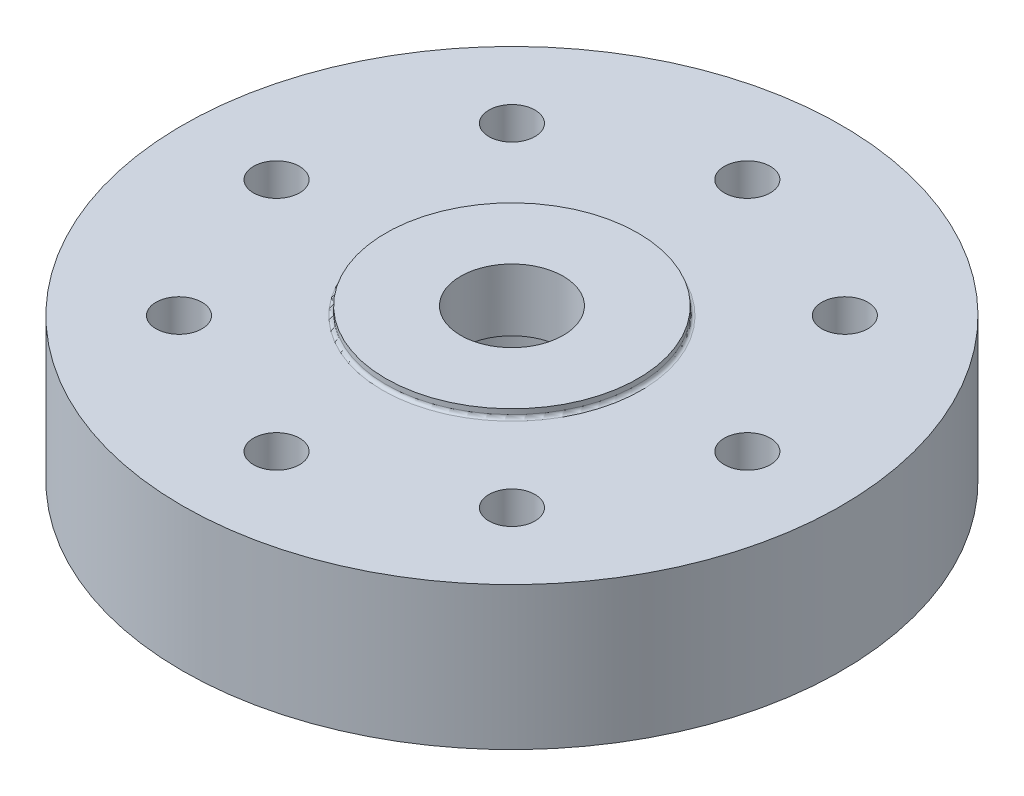
ISO-10303-21;
HEADER;
FILE_DESCRIPTION(('STEP AP214'),'2;1');
FILE_NAME('part.step','',(''),(''),'','','');
FILE_SCHEMA(('AUTOMOTIVE_DESIGN { 1 0 10303 214 1 1 1 1 }'));
ENDSEC;
DATA;
#1=APPLICATION_CONTEXT('core data for automotive mechanical design processes');
#2=APPLICATION_PROTOCOL_DEFINITION('international standard','automotive_design',2000,#1);
#3=PRODUCT_CONTEXT('',#1,'mechanical');
#4=PRODUCT('Part','Part','',(#3));
#5=PRODUCT_RELATED_PRODUCT_CATEGORY('part','',(#4));
#6=PRODUCT_DEFINITION_FORMATION('','',#4);
#7=PRODUCT_DEFINITION_CONTEXT('part definition',#1,'design');
#8=PRODUCT_DEFINITION('design','',#6,#7);
#9=PRODUCT_DEFINITION_SHAPE('','',#8);
#10=(LENGTH_UNIT() NAMED_UNIT(*) SI_UNIT(.MILLI.,.METRE.));
#11=(NAMED_UNIT(*) PLANE_ANGLE_UNIT() SI_UNIT($,.RADIAN.));
#12=(NAMED_UNIT(*) SI_UNIT($,.STERADIAN.) SOLID_ANGLE_UNIT());
#13=UNCERTAINTY_MEASURE_WITH_UNIT(LENGTH_MEASURE(1.E-05),#10,'distance_accuracy_value','');
#14=(GEOMETRIC_REPRESENTATION_CONTEXT(3) GLOBAL_UNCERTAINTY_ASSIGNED_CONTEXT((#13)) GLOBAL_UNIT_ASSIGNED_CONTEXT((#10,
#11,#12)) REPRESENTATION_CONTEXT('',''));
#15=CARTESIAN_POINT('',(0.,0.,0.));
#16=DIRECTION('',(0.,0.,1.));
#17=DIRECTION('',(1.,0.,0.));
#18=AXIS2_PLACEMENT_3D('',#15,#16,#17);
#19=CARTESIAN_POINT('',(0.,4.25,0.));
#20=DIRECTION('',(0.,1.,0.));
#21=DIRECTION('',(0.,0.,1.));
#22=AXIS2_PLACEMENT_3D('',#19,#20,#21);
#23=PLANE('',#22);
#24=CARTESIAN_POINT('',(0.,4.25,0.));
#25=DIRECTION('',(0.,1.,0.));
#26=DIRECTION('',(0.,0.,1.));
#27=AXIS2_PLACEMENT_3D('',#24,#25,#26);
#28=CIRCLE('',#27,3.85);
#29=CARTESIAN_POINT('',(0.,4.25,3.85));
#30=VERTEX_POINT('',#29);
#31=EDGE_CURVE('E11',#30,#30,#28,.F.);
#32=ORIENTED_EDGE('',*,*,#31,.T.);
#33=EDGE_LOOP('',(#32));
#34=FACE_BOUND('',#33,.T.);
#35=CARTESIAN_POINT('',(-4.94974746830577,4.25,-4.94974746830589));
#36=DIRECTION('',(0.,1.,0.));
#37=DIRECTION('',(0.,0.,1.));
#38=AXIS2_PLACEMENT_3D('',#35,#36,#37);
#39=CIRCLE('',#38,0.684999999999999);
#40=CARTESIAN_POINT('',(-4.94974746830577,4.25,-4.26474746830589));
#41=VERTEX_POINT('',#40);
#42=EDGE_CURVE('E326',#41,#41,#39,.T.);
#43=ORIENTED_EDGE('',*,*,#42,.F.);
#44=EDGE_LOOP('',(#43));
#45=FACE_BOUND('',#44,.T.);
#46=CARTESIAN_POINT('',(-4.94974746830588,4.25,4.94974746830579));
#47=DIRECTION('',(0.,1.,0.));
#48=DIRECTION('',(0.,0.,1.));
#49=AXIS2_PLACEMENT_3D('',#46,#47,#48);
#50=CIRCLE('',#49,0.685000000000001);
#51=CARTESIAN_POINT('',(-4.94974746830588,4.25,5.63474746830579));
#52=VERTEX_POINT('',#51);
#53=EDGE_CURVE('E341',#52,#52,#50,.T.);
#54=ORIENTED_EDGE('',*,*,#53,.F.);
#55=EDGE_LOOP('',(#54));
#56=FACE_BOUND('',#55,.T.);
#57=CARTESIAN_POINT('',(4.94974746830581,4.25,4.94974746830586));
#58=DIRECTION('',(0.,1.,0.));
#59=DIRECTION('',(0.,0.,1.));
#60=AXIS2_PLACEMENT_3D('',#57,#58,#59);
#61=CIRCLE('',#60,0.685);
#62=CARTESIAN_POINT('',(4.94974746830581,4.25,5.63474746830586));
#63=VERTEX_POINT('',#62);
#64=EDGE_CURVE('E356',#63,#63,#61,.T.);
#65=ORIENTED_EDGE('',*,*,#64,.F.);
#66=EDGE_LOOP('',(#65));
#67=FACE_BOUND('',#66,.T.);
#68=CARTESIAN_POINT('',(4.94974746830584,4.25,-4.94974746830583));
#69=DIRECTION('',(0.,1.,0.));
#70=DIRECTION('',(0.,0.,1.));
#71=AXIS2_PLACEMENT_3D('',#68,#69,#70);
#72=CIRCLE('',#71,0.685);
#73=CARTESIAN_POINT('',(4.94974746830584,4.25,-4.26474746830583));
#74=VERTEX_POINT('',#73);
#75=EDGE_CURVE('E372',#74,#74,#72,.T.);
#76=ORIENTED_EDGE('',*,*,#75,.F.);
#77=EDGE_LOOP('',(#76));
#78=FACE_BOUND('',#77,.T.);
#79=CARTESIAN_POINT('',(0.,4.25,-7.));
#80=DIRECTION('',(0.,1.,0.));
#81=DIRECTION('',(0.,0.,1.));
#82=AXIS2_PLACEMENT_3D('',#79,#80,#81);
#83=CIRCLE('',#82,0.685);
#84=CARTESIAN_POINT('',(0.,4.25,-6.315));
#85=VERTEX_POINT('',#84);
#86=EDGE_CURVE('E380',#85,#85,#83,.T.);
#87=ORIENTED_EDGE('',*,*,#86,.F.);
#88=EDGE_LOOP('',(#87));
#89=FACE_BOUND('',#88,.T.);
#90=CARTESIAN_POINT('',(0.,4.25,0.));
#91=DIRECTION('',(0.,1.,0.));
#92=DIRECTION('',(0.,0.,1.));
#93=AXIS2_PLACEMENT_3D('',#90,#91,#92);
#94=CIRCLE('',#93,9.8);
#95=CARTESIAN_POINT('',(0.,4.25,9.8));
#96=VERTEX_POINT('',#95);
#97=EDGE_CURVE('E388',#96,#96,#94,.T.);
#98=ORIENTED_EDGE('',*,*,#97,.T.);
#99=EDGE_LOOP('',(#98));
#100=FACE_BOUND('',#99,.T.);
#101=CARTESIAN_POINT('',(7.,4.25,0.));
#102=DIRECTION('',(0.,1.,0.));
#103=DIRECTION('',(0.,0.,1.));
#104=AXIS2_PLACEMENT_3D('',#101,#102,#103);
#105=CIRCLE('',#104,0.685);
#106=CARTESIAN_POINT('',(7.,4.25,0.685000000000024));
#107=VERTEX_POINT('',#106);
#108=EDGE_CURVE('E364',#107,#107,#105,.T.);
#109=ORIENTED_EDGE('',*,*,#108,.F.);
#110=EDGE_LOOP('',(#109));
#111=FACE_BOUND('',#110,.T.);
#112=CARTESIAN_POINT('',(0.,4.25,7.));
#113=DIRECTION('',(0.,1.,0.));
#114=DIRECTION('',(0.,0.,1.));
#115=AXIS2_PLACEMENT_3D('',#112,#113,#114);
#116=CIRCLE('',#115,0.685);
#117=CARTESIAN_POINT('',(0.,4.25,7.685));
#118=VERTEX_POINT('',#117);
#119=EDGE_CURVE('E349',#118,#118,#116,.T.);
#120=ORIENTED_EDGE('',*,*,#119,.F.);
#121=EDGE_LOOP('',(#120));
#122=FACE_BOUND('',#121,.T.);
#123=CARTESIAN_POINT('',(-7.,4.25,0.));
#124=DIRECTION('',(0.,1.,0.));
#125=DIRECTION('',(0.,0.,1.));
#126=AXIS2_PLACEMENT_3D('',#123,#124,#125);
#127=CIRCLE('',#126,0.685);
#128=CARTESIAN_POINT('',(-7.,4.25,0.684999999999927));
#129=VERTEX_POINT('',#128);
#130=EDGE_CURVE('E333',#129,#129,#127,.T.);
#131=ORIENTED_EDGE('',*,*,#130,.F.);
#132=EDGE_LOOP('',(#131));
#133=FACE_BOUND('',#132,.T.);
#134=ADVANCED_FACE('F55',(#34,#45,#56,#67,#78,#89,#100,#111,#122,#133),#23,.T.);
#135=CARTESIAN_POINT('',(0.,4.25,0.));
#136=DIRECTION('',(0.,-1.,0.));
#137=DIRECTION('',(0.,0.,-1.));
#138=AXIS2_PLACEMENT_3D('',#135,#136,#137);
#139=CYLINDRICAL_SURFACE('',#138,1.525);
#140=CARTESIAN_POINT('',(0.,2.65,0.));
#141=DIRECTION('',(0.,-1.,0.));
#142=DIRECTION('',(0.,0.,-1.));
#143=AXIS2_PLACEMENT_3D('',#140,#141,#142);
#144=CIRCLE('',#143,1.525);
#145=CARTESIAN_POINT('',(0.,2.65,-1.525));
#146=VERTEX_POINT('',#145);
#147=EDGE_CURVE('E395',#146,#146,#144,.T.);
#148=ORIENTED_EDGE('',*,*,#147,.T.);
#149=EDGE_LOOP('',(#148));
#150=FACE_BOUND('',#149,.T.);
#151=CARTESIAN_POINT('',(0.,4.5,0.));
#152=DIRECTION('',(0.,1.,0.));
#153=DIRECTION('',(0.,0.,1.));
#154=AXIS2_PLACEMENT_3D('',#151,#152,#153);
#155=CIRCLE('',#154,1.525);
#156=CARTESIAN_POINT('',(0.,4.5,1.525));
#157=VERTEX_POINT('',#156);
#158=EDGE_CURVE('E837',#157,#157,#155,.T.);
#159=ORIENTED_EDGE('',*,*,#158,.T.);
#160=EDGE_LOOP('',(#159));
#161=FACE_BOUND('',#160,.T.);
#162=ADVANCED_FACE('F414',(#150,#161),#139,.F.);
#163=CARTESIAN_POINT('',(0.,0.,0.));
#164=DIRECTION('',(0.,1.,0.));
#165=DIRECTION('',(0.,0.,1.));
#166=AXIS2_PLACEMENT_3D('',#163,#164,#165);
#167=PLANE('',#166);
#168=CARTESIAN_POINT('',(4.94974746830584,0.,-4.94974746830583));
#169=DIRECTION('',(0.,1.,0.));
#170=DIRECTION('',(0.,0.,1.));
#171=AXIS2_PLACEMENT_3D('',#168,#169,#170);
#172=CIRCLE('',#171,1.885);
#173=CARTESIAN_POINT('',(5.25146114998571,0.,-6.81044461031663));
#174=VERTEX_POINT('',#173);
#175=CARTESIAN_POINT('',(6.81044461031665,0.,-5.25146114998569));
#176=VERTEX_POINT('',#175);
#177=EDGE_CURVE('E268',#174,#176,#172,.T.);
#178=ORIENTED_EDGE('',*,*,#177,.F.);
#179=CARTESIAN_POINT('',(0.,0.,0.));
#180=DIRECTION('',(0.,1.,0.));
#181=DIRECTION('',(0.,0.,1.));
#182=AXIS2_PLACEMENT_3D('',#179,#180,#181);
#183=CIRCLE('',#182,8.6);
#184=CARTESIAN_POINT('',(1.10236777655768,0.,-8.52905535714286));
#185=VERTEX_POINT('',#184);
#186=EDGE_CURVE('E215',#174,#185,#183,.T.);
#187=ORIENTED_EDGE('',*,*,#186,.T.);
#188=CARTESIAN_POINT('',(0.,0.,-7.));
#189=DIRECTION('',(0.,1.,0.));
#190=DIRECTION('',(0.,0.,1.));
#191=AXIS2_PLACEMENT_3D('',#188,#189,#190);
#192=CIRCLE('',#191,1.885);
#193=CARTESIAN_POINT('',(-1.10236777655768,0.,-8.52905535714286));
#194=VERTEX_POINT('',#193);
#195=EDGE_CURVE('E263',#194,#185,#192,.T.);
#196=ORIENTED_EDGE('',*,*,#195,.F.);
#197=CARTESIAN_POINT('',(-5.25146114998562,0.,-6.8104446103167));
#198=VERTEX_POINT('',#197);
#199=EDGE_CURVE('E71',#194,#198,#183,.T.);
#200=ORIENTED_EDGE('',*,*,#199,.T.);
#201=CARTESIAN_POINT('',(-4.94974746830577,0.,-4.94974746830589));
#202=DIRECTION('',(0.,1.,0.));
#203=DIRECTION('',(0.,0.,1.));
#204=AXIS2_PLACEMENT_3D('',#201,#202,#203);
#205=CIRCLE('',#204,1.885);
#206=CARTESIAN_POINT('',(-6.81044461031657,0.,-5.25146114998578));
#207=VERTEX_POINT('',#206);
#208=EDGE_CURVE('E248',#207,#198,#205,.T.);
#209=ORIENTED_EDGE('',*,*,#208,.F.);
#210=CARTESIAN_POINT('',(-8.52905535714285,0.,-1.10236777655777));
#211=VERTEX_POINT('',#210);
#212=EDGE_CURVE('E876',#207,#211,#183,.T.);
#213=ORIENTED_EDGE('',*,*,#212,.T.);
#214=CARTESIAN_POINT('',(-7.,0.,0.));
#215=DIRECTION('',(0.,1.,0.));
#216=DIRECTION('',(0.,0.,1.));
#217=AXIS2_PLACEMENT_3D('',#214,#215,#216);
#218=CIRCLE('',#217,1.885);
#219=CARTESIAN_POINT('',(-8.52905535714287,0.,1.10236777655759));
#220=VERTEX_POINT('',#219);
#221=EDGE_CURVE('E190',#220,#211,#218,.T.);
#222=ORIENTED_EDGE('',*,*,#221,.F.);
#223=CARTESIAN_POINT('',(-6.81044461031669,0.,5.25146114998564));
#224=VERTEX_POINT('',#223);
#225=EDGE_CURVE('E174',#220,#224,#183,.T.);
#226=ORIENTED_EDGE('',*,*,#225,.T.);
#227=CARTESIAN_POINT('',(-4.94974746830588,0.,4.94974746830579));
#228=DIRECTION('',(0.,1.,0.));
#229=DIRECTION('',(0.,0.,1.));
#230=AXIS2_PLACEMENT_3D('',#227,#228,#229);
#231=CIRCLE('',#230,1.885);
#232=CARTESIAN_POINT('',(-5.25146114998576,0.,6.81044461031659));
#233=VERTEX_POINT('',#232);
#234=EDGE_CURVE('E189',#233,#224,#231,.T.);
#235=ORIENTED_EDGE('',*,*,#234,.F.);
#236=CARTESIAN_POINT('',(-1.10236777655774,0.,8.52905535714285));
#237=VERTEX_POINT('',#236);
#238=EDGE_CURVE('E884',#233,#237,#183,.T.);
#239=ORIENTED_EDGE('',*,*,#238,.T.);
#240=CARTESIAN_POINT('',(0.,0.,7.));
#241=DIRECTION('',(0.,1.,0.));
#242=DIRECTION('',(0.,0.,1.));
#243=AXIS2_PLACEMENT_3D('',#240,#241,#242);
#244=CIRCLE('',#243,1.885);
#245=CARTESIAN_POINT('',(1.10236777655762,0.,8.52905535714287));
#246=VERTEX_POINT('',#245);
#247=EDGE_CURVE('E282',#246,#237,#244,.T.);
#248=ORIENTED_EDGE('',*,*,#247,.F.);
#249=CARTESIAN_POINT('',(5.25146114998567,0.,6.81044461031666));
#250=VERTEX_POINT('',#249);
#251=EDGE_CURVE('E887',#246,#250,#183,.T.);
#252=ORIENTED_EDGE('',*,*,#251,.T.);
#253=CARTESIAN_POINT('',(4.94974746830581,0.,4.94974746830586));
#254=DIRECTION('',(0.,1.,0.));
#255=DIRECTION('',(0.,0.,1.));
#256=AXIS2_PLACEMENT_3D('',#253,#254,#255);
#257=CIRCLE('',#256,1.885);
#258=CARTESIAN_POINT('',(6.81044461031661,0.,5.25146114998574));
#259=VERTEX_POINT('',#258);
#260=EDGE_CURVE('E277',#259,#250,#257,.T.);
#261=ORIENTED_EDGE('',*,*,#260,.F.);
#262=CARTESIAN_POINT('',(8.52905535714286,0.,1.10236777655771));
#263=VERTEX_POINT('',#262);
#264=EDGE_CURVE('E870',#259,#263,#183,.T.);
#265=ORIENTED_EDGE('',*,*,#264,.T.);
#266=CARTESIAN_POINT('',(7.,0.,0.));
#267=DIRECTION('',(0.,1.,0.));
#268=DIRECTION('',(0.,0.,1.));
#269=AXIS2_PLACEMENT_3D('',#266,#267,#268);
#270=CIRCLE('',#269,1.885);
#271=CARTESIAN_POINT('',(8.52905535714286,0.,-1.10236777655765));
#272=VERTEX_POINT('',#271);
#273=EDGE_CURVE('E273',#272,#263,#270,.T.);
#274=ORIENTED_EDGE('',*,*,#273,.F.);
#275=EDGE_CURVE('E262',#272,#176,#183,.T.);
#276=ORIENTED_EDGE('',*,*,#275,.T.);
#277=EDGE_LOOP('',(#178,#187,#196,#200,#209,#213,#222,#226,#235,#239,#248,#252,#261,#265,#274,#276));
#278=FACE_BOUND('',#277,.T.);
#279=CARTESIAN_POINT('',(0.,0.,0.));
#280=DIRECTION('',(0.,1.,0.));
#281=DIRECTION('',(0.,0.,1.));
#282=AXIS2_PLACEMENT_3D('',#279,#280,#281);
#283=CIRCLE('',#282,9.8);
#284=CARTESIAN_POINT('',(0.,0.,9.8));
#285=VERTEX_POINT('',#284);
#286=EDGE_CURVE('E384',#285,#285,#283,.T.);
#287=ORIENTED_EDGE('',*,*,#286,.F.);
#288=EDGE_LOOP('',(#287));
#289=FACE_BOUND('',#288,.T.);
#290=CARTESIAN_POINT('',(0.,0.,-7.));
#291=DIRECTION('',(0.,1.,0.));
#292=DIRECTION('',(0.,0.,1.));
#293=AXIS2_PLACEMENT_3D('',#290,#291,#292);
#294=CIRCLE('',#293,0.685);
#295=CARTESIAN_POINT('',(0.,0.,-6.315));
#296=VERTEX_POINT('',#295);
#297=EDGE_CURVE('E376',#296,#296,#294,.T.);
#298=ORIENTED_EDGE('',*,*,#297,.T.);
#299=EDGE_LOOP('',(#298));
#300=FACE_BOUND('',#299,.T.);
#301=CARTESIAN_POINT('',(4.94974746830584,0.,-4.94974746830583));
#302=DIRECTION('',(0.,1.,0.));
#303=DIRECTION('',(0.,0.,1.));
#304=AXIS2_PLACEMENT_3D('',#301,#302,#303);
#305=CIRCLE('',#304,0.685);
#306=CARTESIAN_POINT('',(4.94974746830584,0.,-4.26474746830583));
#307=VERTEX_POINT('',#306);
#308=EDGE_CURVE('E368',#307,#307,#305,.T.);
#309=ORIENTED_EDGE('',*,*,#308,.T.);
#310=EDGE_LOOP('',(#309));
#311=FACE_BOUND('',#310,.T.);
#312=CARTESIAN_POINT('',(7.,0.,0.));
#313=DIRECTION('',(0.,1.,0.));
#314=DIRECTION('',(0.,0.,1.));
#315=AXIS2_PLACEMENT_3D('',#312,#313,#314);
#316=CIRCLE('',#315,0.685);
#317=CARTESIAN_POINT('',(7.,0.,0.685000000000024));
#318=VERTEX_POINT('',#317);
#319=EDGE_CURVE('E360',#318,#318,#316,.T.);
#320=ORIENTED_EDGE('',*,*,#319,.T.);
#321=EDGE_LOOP('',(#320));
#322=FACE_BOUND('',#321,.T.);
#323=CARTESIAN_POINT('',(4.94974746830581,0.,4.94974746830586));
#324=DIRECTION('',(0.,1.,0.));
#325=DIRECTION('',(0.,0.,1.));
#326=AXIS2_PLACEMENT_3D('',#323,#324,#325);
#327=CIRCLE('',#326,0.685);
#328=CARTESIAN_POINT('',(4.94974746830581,0.,5.63474746830586));
#329=VERTEX_POINT('',#328);
#330=EDGE_CURVE('E352',#329,#329,#327,.T.);
#331=ORIENTED_EDGE('',*,*,#330,.T.);
#332=EDGE_LOOP('',(#331));
#333=FACE_BOUND('',#332,.T.);
#334=CARTESIAN_POINT('',(0.,0.,7.));
#335=DIRECTION('',(0.,1.,0.));
#336=DIRECTION('',(0.,0.,1.));
#337=AXIS2_PLACEMENT_3D('',#334,#335,#336);
#338=CIRCLE('',#337,0.685);
#339=CARTESIAN_POINT('',(0.,0.,7.685));
#340=VERTEX_POINT('',#339);
#341=EDGE_CURVE('E345',#340,#340,#338,.T.);
#342=ORIENTED_EDGE('',*,*,#341,.T.);
#343=EDGE_LOOP('',(#342));
#344=FACE_BOUND('',#343,.T.);
#345=CARTESIAN_POINT('',(-4.94974746830588,0.,4.94974746830579));
#346=DIRECTION('',(0.,1.,0.));
#347=DIRECTION('',(0.,0.,1.));
#348=AXIS2_PLACEMENT_3D('',#345,#346,#347);
#349=CIRCLE('',#348,0.685000000000001);
#350=CARTESIAN_POINT('',(-4.94974746830588,0.,5.63474746830579));
#351=VERTEX_POINT('',#350);
#352=EDGE_CURVE('E337',#351,#351,#349,.T.);
#353=ORIENTED_EDGE('',*,*,#352,.T.);
#354=EDGE_LOOP('',(#353));
#355=FACE_BOUND('',#354,.T.);
#356=CARTESIAN_POINT('',(-7.,0.,0.));
#357=DIRECTION('',(0.,1.,0.));
#358=DIRECTION('',(0.,0.,1.));
#359=AXIS2_PLACEMENT_3D('',#356,#357,#358);
#360=CIRCLE('',#359,0.685);
#361=CARTESIAN_POINT('',(-7.,0.,0.684999999999927));
#362=VERTEX_POINT('',#361);
#363=EDGE_CURVE('E330',#362,#362,#360,.T.);
#364=ORIENTED_EDGE('',*,*,#363,.T.);
#365=EDGE_LOOP('',(#364));
#366=FACE_BOUND('',#365,.T.);
#367=CARTESIAN_POINT('',(-4.94974746830577,0.,-4.94974746830589));
#368=DIRECTION('',(0.,1.,0.));
#369=DIRECTION('',(0.,0.,1.));
#370=AXIS2_PLACEMENT_3D('',#367,#368,#369);
#371=CIRCLE('',#370,0.684999999999999);
#372=CARTESIAN_POINT('',(-4.94974746830577,0.,-4.26474746830589));
#373=VERTEX_POINT('',#372);
#374=EDGE_CURVE('E325',#373,#373,#371,.T.);
#375=ORIENTED_EDGE('',*,*,#374,.T.);
#376=EDGE_LOOP('',(#375));
#377=FACE_BOUND('',#376,.T.);
#378=ADVANCED_FACE('F419',(#278,#289,#300,#311,#322,#333,#344,#355,#366,#377),#167,.F.);
#379=CARTESIAN_POINT('',(0.,4.25,0.));
#380=DIRECTION('',(0.,-1.,0.));
#381=DIRECTION('',(0.,0.,-1.));
#382=AXIS2_PLACEMENT_3D('',#379,#380,#381);
#383=CYLINDRICAL_SURFACE('',#382,9.8);
#384=ORIENTED_EDGE('',*,*,#97,.F.);
#385=EDGE_LOOP('',(#384));
#386=FACE_BOUND('',#385,.T.);
#387=ORIENTED_EDGE('',*,*,#286,.T.);
#388=EDGE_LOOP('',(#387));
#389=FACE_BOUND('',#388,.T.);
#390=ADVANCED_FACE('F427',(#386,#389),#383,.T.);
#391=CARTESIAN_POINT('',(0.,4.25,-7.));
#392=DIRECTION('',(0.,-1.,0.));
#393=DIRECTION('',(0.,0.,-1.));
#394=AXIS2_PLACEMENT_3D('',#391,#392,#393);
#395=CYLINDRICAL_SURFACE('',#394,0.685);
#396=ORIENTED_EDGE('',*,*,#86,.T.);
#397=EDGE_LOOP('',(#396));
#398=FACE_BOUND('',#397,.T.);
#399=ORIENTED_EDGE('',*,*,#297,.F.);
#400=EDGE_LOOP('',(#399));
#401=FACE_BOUND('',#400,.T.);
#402=ADVANCED_FACE('F425',(#398,#401),#395,.F.);
#403=CARTESIAN_POINT('',(4.94974746830584,4.25,-4.94974746830583));
#404=DIRECTION('',(0.,-1.,0.));
#405=DIRECTION('',(0.,0.,-1.));
#406=AXIS2_PLACEMENT_3D('',#403,#404,#405);
#407=CYLINDRICAL_SURFACE('',#406,0.685);
#408=ORIENTED_EDGE('',*,*,#75,.T.);
#409=EDGE_LOOP('',(#408));
#410=FACE_BOUND('',#409,.T.);
#411=ORIENTED_EDGE('',*,*,#308,.F.);
#412=EDGE_LOOP('',(#411));
#413=FACE_BOUND('',#412,.T.);
#414=ADVANCED_FACE('F433',(#410,#413),#407,.F.);
#415=CARTESIAN_POINT('',(7.,4.25,0.));
#416=DIRECTION('',(0.,-1.,0.));
#417=DIRECTION('',(0.,0.,-1.));
#418=AXIS2_PLACEMENT_3D('',#415,#416,#417);
#419=CYLINDRICAL_SURFACE('',#418,0.685);
#420=ORIENTED_EDGE('',*,*,#108,.T.);
#421=EDGE_LOOP('',(#420));
#422=FACE_BOUND('',#421,.T.);
#423=ORIENTED_EDGE('',*,*,#319,.F.);
#424=EDGE_LOOP('',(#423));
#425=FACE_BOUND('',#424,.T.);
#426=ADVANCED_FACE('F485',(#422,#425),#419,.F.);
#427=CARTESIAN_POINT('',(4.94974746830581,4.25,4.94974746830586));
#428=DIRECTION('',(0.,-1.,0.));
#429=DIRECTION('',(0.,0.,-1.));
#430=AXIS2_PLACEMENT_3D('',#427,#428,#429);
#431=CYLINDRICAL_SURFACE('',#430,0.685);
#432=ORIENTED_EDGE('',*,*,#64,.T.);
#433=EDGE_LOOP('',(#432));
#434=FACE_BOUND('',#433,.T.);
#435=ORIENTED_EDGE('',*,*,#330,.F.);
#436=EDGE_LOOP('',(#435));
#437=FACE_BOUND('',#436,.T.);
#438=ADVANCED_FACE('F481',(#434,#437),#431,.F.);
#439=CARTESIAN_POINT('',(0.,4.25,7.));
#440=DIRECTION('',(0.,-1.,0.));
#441=DIRECTION('',(0.,0.,-1.));
#442=AXIS2_PLACEMENT_3D('',#439,#440,#441);
#443=CYLINDRICAL_SURFACE('',#442,0.685);
#444=ORIENTED_EDGE('',*,*,#119,.T.);
#445=EDGE_LOOP('',(#444));
#446=FACE_BOUND('',#445,.T.);
#447=ORIENTED_EDGE('',*,*,#341,.F.);
#448=EDGE_LOOP('',(#447));
#449=FACE_BOUND('',#448,.T.);
#450=ADVANCED_FACE('F477',(#446,#449),#443,.F.);
#451=CARTESIAN_POINT('',(-4.94974746830588,4.25,4.94974746830579));
#452=DIRECTION('',(0.,-1.,0.));
#453=DIRECTION('',(0.,0.,-1.));
#454=AXIS2_PLACEMENT_3D('',#451,#452,#453);
#455=CYLINDRICAL_SURFACE('',#454,0.685000000000001);
#456=ORIENTED_EDGE('',*,*,#53,.T.);
#457=EDGE_LOOP('',(#456));
#458=FACE_BOUND('',#457,.T.);
#459=ORIENTED_EDGE('',*,*,#352,.F.);
#460=EDGE_LOOP('',(#459));
#461=FACE_BOUND('',#460,.T.);
#462=ADVANCED_FACE('F468',(#458,#461),#455,.F.);
#463=CARTESIAN_POINT('',(-7.,4.25,0.));
#464=DIRECTION('',(0.,-1.,0.));
#465=DIRECTION('',(0.,0.,-1.));
#466=AXIS2_PLACEMENT_3D('',#463,#464,#465);
#467=CYLINDRICAL_SURFACE('',#466,0.685);
#468=ORIENTED_EDGE('',*,*,#130,.T.);
#469=EDGE_LOOP('',(#468));
#470=FACE_BOUND('',#469,.T.);
#471=ORIENTED_EDGE('',*,*,#363,.F.);
#472=EDGE_LOOP('',(#471));
#473=FACE_BOUND('',#472,.T.);
#474=ADVANCED_FACE('F459',(#470,#473),#467,.F.);
#475=CARTESIAN_POINT('',(-4.94974746830577,4.25,-4.94974746830589));
#476=DIRECTION('',(0.,-1.,0.));
#477=DIRECTION('',(0.,0.,-1.));
#478=AXIS2_PLACEMENT_3D('',#475,#476,#477);
#479=CYLINDRICAL_SURFACE('',#478,0.684999999999999);
#480=ORIENTED_EDGE('',*,*,#42,.T.);
#481=EDGE_LOOP('',(#480));
#482=FACE_BOUND('',#481,.T.);
#483=ORIENTED_EDGE('',*,*,#374,.F.);
#484=EDGE_LOOP('',(#483));
#485=FACE_BOUND('',#484,.T.);
#486=ADVANCED_FACE('F456',(#482,#485),#479,.F.);
#487=CARTESIAN_POINT('',(0.,4.25,0.));
#488=DIRECTION('',(0.,-1.,0.));
#489=DIRECTION('',(0.,0.,-1.));
#490=AXIS2_PLACEMENT_3D('',#487,#488,#489);
#491=CYLINDRICAL_SURFACE('',#490,8.6);
#492=DIRECTION('',(0.,-1.,0.));
#493=VECTOR('',#492,1.);
#494=CARTESIAN_POINT('',(1.10236777655768,4.25,-8.52905535714286));
#495=LINE('',#494,#493);
#496=CARTESIAN_POINT('',(1.10236777655768,3.05,-8.52905535714286));
#497=VERTEX_POINT('',#496);
#498=EDGE_CURVE('E322',#497,#185,#495,.T.);
#499=ORIENTED_EDGE('',*,*,#498,.T.);
#500=ORIENTED_EDGE('',*,*,#186,.F.);
#501=DIRECTION('',(0.,-1.,0.));
#502=VECTOR('',#501,1.);
#503=CARTESIAN_POINT('',(5.25146114998571,4.25,-6.81044461031663));
#504=LINE('',#503,#502);
#505=CARTESIAN_POINT('',(5.25146114998571,3.05,-6.81044461031663));
#506=VERTEX_POINT('',#505);
#507=EDGE_CURVE('E317',#506,#174,#504,.T.);
#508=ORIENTED_EDGE('',*,*,#507,.F.);
#509=CARTESIAN_POINT('',(0.,3.05,0.));
#510=DIRECTION('',(0.,1.,0.));
#511=DIRECTION('',(0.,0.,1.));
#512=AXIS2_PLACEMENT_3D('',#509,#510,#511);
#513=CIRCLE('',#512,8.6);
#514=EDGE_CURVE('E225',#506,#497,#513,.T.);
#515=ORIENTED_EDGE('',*,*,#514,.T.);
#516=EDGE_LOOP('',(#499,#500,#508,#515));
#517=FACE_BOUND('',#516,.T.);
#518=ADVANCED_FACE('F458',(#517),#491,.F.);
#519=CARTESIAN_POINT('',(-1.10236777655768,3.05,-8.52905535714286));
#520=VERTEX_POINT('',#519);
#521=CARTESIAN_POINT('',(-5.25146114998562,3.05,-6.8104446103167));
#522=VERTEX_POINT('',#521);
#523=EDGE_CURVE('E214',#520,#522,#513,.T.);
#524=ORIENTED_EDGE('',*,*,#523,.T.);
#525=DIRECTION('',(0.,-1.,0.));
#526=VECTOR('',#525,1.);
#527=CARTESIAN_POINT('',(-5.25146114998561,4.25,-6.8104446103167));
#528=LINE('',#527,#526);
#529=EDGE_CURVE('E76',#522,#198,#528,.T.);
#530=ORIENTED_EDGE('',*,*,#529,.T.);
#531=ORIENTED_EDGE('',*,*,#199,.F.);
#532=DIRECTION('',(0.,-1.,0.));
#533=VECTOR('',#532,1.);
#534=CARTESIAN_POINT('',(-1.10236777655768,4.25,-8.52905535714286));
#535=LINE('',#534,#533);
#536=EDGE_CURVE('E238',#520,#194,#535,.T.);
#537=ORIENTED_EDGE('',*,*,#536,.F.);
#538=EDGE_LOOP('',(#524,#530,#531,#537));
#539=FACE_BOUND('',#538,.T.);
#540=ADVANCED_FACE('F237',(#539),#491,.F.);
#541=DIRECTION('',(0.,-1.,0.));
#542=VECTOR('',#541,1.);
#543=CARTESIAN_POINT('',(6.81044461031665,4.25,-5.25146114998569));
#544=LINE('',#543,#542);
#545=CARTESIAN_POINT('',(6.81044461031665,3.05,-5.25146114998569));
#546=VERTEX_POINT('',#545);
#547=EDGE_CURVE('E314',#546,#176,#544,.T.);
#548=ORIENTED_EDGE('',*,*,#547,.T.);
#549=ORIENTED_EDGE('',*,*,#275,.F.);
#550=DIRECTION('',(0.,-1.,0.));
#551=VECTOR('',#550,1.);
#552=CARTESIAN_POINT('',(8.52905535714286,4.25,-1.10236777655765));
#553=LINE('',#552,#551);
#554=CARTESIAN_POINT('',(8.52905535714286,3.05,-1.10236777655765));
#555=VERTEX_POINT('',#554);
#556=EDGE_CURVE('E312',#555,#272,#553,.T.);
#557=ORIENTED_EDGE('',*,*,#556,.F.);
#558=EDGE_CURVE('E218',#555,#546,#513,.T.);
#559=ORIENTED_EDGE('',*,*,#558,.T.);
#560=EDGE_LOOP('',(#548,#549,#557,#559));
#561=FACE_BOUND('',#560,.T.);
#562=ADVANCED_FACE('F555',(#561),#491,.F.);
#563=DIRECTION('',(0.,-1.,0.));
#564=VECTOR('',#563,1.);
#565=CARTESIAN_POINT('',(8.52905535714286,4.25,1.10236777655771));
#566=LINE('',#565,#564);
#567=CARTESIAN_POINT('',(8.52905535714286,3.05,1.10236777655771));
#568=VERTEX_POINT('',#567);
#569=EDGE_CURVE('E309',#568,#263,#566,.T.);
#570=ORIENTED_EDGE('',*,*,#569,.T.);
#571=ORIENTED_EDGE('',*,*,#264,.F.);
#572=DIRECTION('',(0.,-1.,0.));
#573=VECTOR('',#572,1.);
#574=CARTESIAN_POINT('',(6.81044461031661,4.25,5.25146114998574));
#575=LINE('',#574,#573);
#576=CARTESIAN_POINT('',(6.81044461031661,3.05,5.25146114998574));
#577=VERTEX_POINT('',#576);
#578=EDGE_CURVE('E306',#577,#259,#575,.T.);
#579=ORIENTED_EDGE('',*,*,#578,.F.);
#580=EDGE_CURVE('E210',#577,#568,#513,.T.);
#581=ORIENTED_EDGE('',*,*,#580,.T.);
#582=EDGE_LOOP('',(#570,#571,#579,#581));
#583=FACE_BOUND('',#582,.T.);
#584=ADVANCED_FACE('F563',(#583),#491,.F.);
#585=DIRECTION('',(0.,-1.,0.));
#586=VECTOR('',#585,1.);
#587=CARTESIAN_POINT('',(5.25146114998566,4.25,6.81044461031667));
#588=LINE('',#587,#586);
#589=CARTESIAN_POINT('',(5.25146114998567,3.05,6.81044461031666));
#590=VERTEX_POINT('',#589);
#591=EDGE_CURVE('E303',#590,#250,#588,.T.);
#592=ORIENTED_EDGE('',*,*,#591,.T.);
#593=ORIENTED_EDGE('',*,*,#251,.F.);
#594=DIRECTION('',(0.,-1.,0.));
#595=VECTOR('',#594,1.);
#596=CARTESIAN_POINT('',(1.10236777655762,4.25,8.52905535714287));
#597=LINE('',#596,#595);
#598=CARTESIAN_POINT('',(1.10236777655762,3.05,8.52905535714287));
#599=VERTEX_POINT('',#598);
#600=EDGE_CURVE('E300',#599,#246,#597,.T.);
#601=ORIENTED_EDGE('',*,*,#600,.F.);
#602=EDGE_CURVE('E202',#599,#590,#513,.T.);
#603=ORIENTED_EDGE('',*,*,#602,.T.);
#604=EDGE_LOOP('',(#592,#593,#601,#603));
#605=FACE_BOUND('',#604,.T.);
#606=ADVANCED_FACE('F571',(#605),#491,.F.);
#607=DIRECTION('',(0.,-1.,0.));
#608=VECTOR('',#607,1.);
#609=CARTESIAN_POINT('',(-1.10236777655774,4.25,8.52905535714285));
#610=LINE('',#609,#608);
#611=CARTESIAN_POINT('',(-1.10236777655774,3.05,8.52905535714285));
#612=VERTEX_POINT('',#611);
#613=EDGE_CURVE('E297',#612,#237,#610,.T.);
#614=ORIENTED_EDGE('',*,*,#613,.T.);
#615=ORIENTED_EDGE('',*,*,#238,.F.);
#616=DIRECTION('',(0.,-1.,0.));
#617=VECTOR('',#616,1.);
#618=CARTESIAN_POINT('',(-5.25146114998576,4.25,6.8104446103166));
#619=LINE('',#618,#617);
#620=CARTESIAN_POINT('',(-5.25146114998576,3.05,6.81044461031659));
#621=VERTEX_POINT('',#620);
#622=EDGE_CURVE('E294',#621,#233,#619,.T.);
#623=ORIENTED_EDGE('',*,*,#622,.F.);
#624=EDGE_CURVE('E199',#621,#612,#513,.T.);
#625=ORIENTED_EDGE('',*,*,#624,.T.);
#626=EDGE_LOOP('',(#614,#615,#623,#625));
#627=FACE_BOUND('',#626,.T.);
#628=ADVANCED_FACE('F580',(#627),#491,.F.);
#629=DIRECTION('',(0.,-1.,0.));
#630=VECTOR('',#629,1.);
#631=CARTESIAN_POINT('',(-6.81044461031669,4.25,5.25146114998564));
#632=LINE('',#631,#630);
#633=CARTESIAN_POINT('',(-6.81044461031669,3.05,5.25146114998564));
#634=VERTEX_POINT('',#633);
#635=EDGE_CURVE('E179',#634,#224,#632,.T.);
#636=ORIENTED_EDGE('',*,*,#635,.T.);
#637=ORIENTED_EDGE('',*,*,#225,.F.);
#638=DIRECTION('',(0.,-1.,0.));
#639=VECTOR('',#638,1.);
#640=CARTESIAN_POINT('',(-8.52905535714287,4.25,1.10236777655759));
#641=LINE('',#640,#639);
#642=CARTESIAN_POINT('',(-8.52905535714287,3.05,1.10236777655759));
#643=VERTEX_POINT('',#642);
#644=EDGE_CURVE('E168',#643,#220,#641,.T.);
#645=ORIENTED_EDGE('',*,*,#644,.F.);
#646=EDGE_CURVE('E172',#643,#634,#513,.T.);
#647=ORIENTED_EDGE('',*,*,#646,.T.);
#648=EDGE_LOOP('',(#636,#637,#645,#647));
#649=FACE_BOUND('',#648,.T.);
#650=ADVANCED_FACE('F170',(#649),#491,.F.);
#651=CARTESIAN_POINT('',(0.,3.05,0.));
#652=DIRECTION('',(0.,1.,0.));
#653=DIRECTION('',(0.,0.,1.));
#654=AXIS2_PLACEMENT_3D('',#651,#652,#653);
#655=PLANE('',#654);
#656=CARTESIAN_POINT('',(0.,3.05,0.));
#657=DIRECTION('',(0.,1.,0.));
#658=DIRECTION('',(0.,0.,1.));
#659=AXIS2_PLACEMENT_3D('',#656,#657,#658);
#660=CIRCLE('',#659,4.4);
#661=CARTESIAN_POINT('',(0.,3.05,-4.4));
#662=VERTEX_POINT('',#661);
#663=EDGE_CURVE('E254',#662,#662,#660,.F.);
#664=ORIENTED_EDGE('',*,*,#663,.F.);
#665=EDGE_LOOP('',(#664));
#666=FACE_BOUND('',#665,.T.);
#667=ORIENTED_EDGE('',*,*,#523,.F.);
#668=CARTESIAN_POINT('',(0.,3.05,-7.));
#669=DIRECTION('',(0.,1.,0.));
#670=DIRECTION('',(0.,0.,1.));
#671=AXIS2_PLACEMENT_3D('',#668,#669,#670);
#672=CIRCLE('',#671,1.885);
#673=EDGE_CURVE('E243',#520,#497,#672,.T.);
#674=ORIENTED_EDGE('',*,*,#673,.T.);
#675=ORIENTED_EDGE('',*,*,#514,.F.);
#676=CARTESIAN_POINT('',(4.94974746830584,3.05,-4.94974746830583));
#677=DIRECTION('',(0.,1.,0.));
#678=DIRECTION('',(0.,0.,1.));
#679=AXIS2_PLACEMENT_3D('',#676,#677,#678);
#680=CIRCLE('',#679,1.885);
#681=EDGE_CURVE('E267',#506,#546,#680,.T.);
#682=ORIENTED_EDGE('',*,*,#681,.T.);
#683=ORIENTED_EDGE('',*,*,#558,.F.);
#684=CARTESIAN_POINT('',(7.,3.05,0.));
#685=DIRECTION('',(0.,1.,0.));
#686=DIRECTION('',(0.,0.,1.));
#687=AXIS2_PLACEMENT_3D('',#684,#685,#686);
#688=CIRCLE('',#687,1.885);
#689=EDGE_CURVE('E272',#555,#568,#688,.T.);
#690=ORIENTED_EDGE('',*,*,#689,.T.);
#691=ORIENTED_EDGE('',*,*,#580,.F.);
#692=CARTESIAN_POINT('',(4.94974746830581,3.05,4.94974746830586));
#693=DIRECTION('',(0.,1.,0.));
#694=DIRECTION('',(0.,0.,1.));
#695=AXIS2_PLACEMENT_3D('',#692,#693,#694);
#696=CIRCLE('',#695,1.885);
#697=EDGE_CURVE('E276',#577,#590,#696,.T.);
#698=ORIENTED_EDGE('',*,*,#697,.T.);
#699=ORIENTED_EDGE('',*,*,#602,.F.);
#700=CARTESIAN_POINT('',(0.,3.05,7.));
#701=DIRECTION('',(0.,1.,0.));
#702=DIRECTION('',(0.,0.,1.));
#703=AXIS2_PLACEMENT_3D('',#700,#701,#702);
#704=CIRCLE('',#703,1.885);
#705=EDGE_CURVE('E281',#599,#612,#704,.T.);
#706=ORIENTED_EDGE('',*,*,#705,.T.);
#707=ORIENTED_EDGE('',*,*,#624,.F.);
#708=CARTESIAN_POINT('',(-4.94974746830588,3.05,4.94974746830579));
#709=DIRECTION('',(0.,1.,0.));
#710=DIRECTION('',(0.,0.,1.));
#711=AXIS2_PLACEMENT_3D('',#708,#709,#710);
#712=CIRCLE('',#711,1.885);
#713=EDGE_CURVE('E197',#621,#634,#712,.T.);
#714=ORIENTED_EDGE('',*,*,#713,.T.);
#715=ORIENTED_EDGE('',*,*,#646,.F.);
#716=CARTESIAN_POINT('',(-7.,3.05,0.));
#717=DIRECTION('',(0.,1.,0.));
#718=DIRECTION('',(0.,0.,1.));
#719=AXIS2_PLACEMENT_3D('',#716,#717,#718);
#720=CIRCLE('',#719,1.885);
#721=CARTESIAN_POINT('',(-8.52905535714285,3.05,-1.10236777655777));
#722=VERTEX_POINT('',#721);
#723=EDGE_CURVE('E183',#643,#722,#720,.T.);
#724=ORIENTED_EDGE('',*,*,#723,.T.);
#725=CARTESIAN_POINT('',(-6.81044461031657,3.05,-5.25146114998578));
#726=VERTEX_POINT('',#725);
#727=EDGE_CURVE('E201',#726,#722,#513,.T.);
#728=ORIENTED_EDGE('',*,*,#727,.F.);
#729=CARTESIAN_POINT('',(-4.94974746830577,3.05,-4.94974746830589));
#730=DIRECTION('',(0.,1.,0.));
#731=DIRECTION('',(0.,0.,1.));
#732=AXIS2_PLACEMENT_3D('',#729,#730,#731);
#733=CIRCLE('',#732,1.885);
#734=EDGE_CURVE('E245',#726,#522,#733,.T.);
#735=ORIENTED_EDGE('',*,*,#734,.T.);
#736=EDGE_LOOP('',(#667,#674,#675,#682,#683,#690,#691,#698,#699,#706,#707,#714,#715,#724,#728,#735));
#737=FACE_BOUND('',#736,.T.);
#738=ADVANCED_FACE('F194',(#666,#737),#655,.F.);
#739=DIRECTION('',(0.,-1.,0.));
#740=VECTOR('',#739,1.);
#741=CARTESIAN_POINT('',(-8.52905535714285,4.25,-1.10236777655777));
#742=LINE('',#741,#740);
#743=EDGE_CURVE('E180',#722,#211,#742,.T.);
#744=ORIENTED_EDGE('',*,*,#743,.T.);
#745=ORIENTED_EDGE('',*,*,#212,.F.);
#746=DIRECTION('',(0.,-1.,0.));
#747=VECTOR('',#746,1.);
#748=CARTESIAN_POINT('',(-6.81044461031657,4.25,-5.25146114998578));
#749=LINE('',#748,#747);
#750=EDGE_CURVE('E206',#726,#207,#749,.T.);
#751=ORIENTED_EDGE('',*,*,#750,.F.);
#752=ORIENTED_EDGE('',*,*,#727,.T.);
#753=EDGE_LOOP('',(#744,#745,#751,#752));
#754=FACE_BOUND('',#753,.T.);
#755=ADVANCED_FACE('F467',(#754),#491,.F.);
#756=CARTESIAN_POINT('',(0.,4.25,-7.));
#757=DIRECTION('',(0.,-1.,0.));
#758=DIRECTION('',(0.,0.,-1.));
#759=AXIS2_PLACEMENT_3D('',#756,#757,#758);
#760=CYLINDRICAL_SURFACE('',#759,1.885);
#761=ORIENTED_EDGE('',*,*,#673,.F.);
#762=ORIENTED_EDGE('',*,*,#536,.T.);
#763=ORIENTED_EDGE('',*,*,#195,.T.);
#764=ORIENTED_EDGE('',*,*,#498,.F.);
#765=EDGE_LOOP('',(#761,#762,#763,#764));
#766=FACE_BOUND('',#765,.T.);
#767=ADVANCED_FACE('F604',(#766),#760,.T.);
#768=CARTESIAN_POINT('',(4.94974746830584,4.25,-4.94974746830583));
#769=DIRECTION('',(0.,-1.,0.));
#770=DIRECTION('',(0.,0.,-1.));
#771=AXIS2_PLACEMENT_3D('',#768,#769,#770);
#772=CYLINDRICAL_SURFACE('',#771,1.885);
#773=ORIENTED_EDGE('',*,*,#507,.T.);
#774=ORIENTED_EDGE('',*,*,#177,.T.);
#775=ORIENTED_EDGE('',*,*,#547,.F.);
#776=ORIENTED_EDGE('',*,*,#681,.F.);
#777=EDGE_LOOP('',(#773,#774,#775,#776));
#778=FACE_BOUND('',#777,.T.);
#779=ADVANCED_FACE('F612',(#778),#772,.T.);
#780=CARTESIAN_POINT('',(7.,4.25,0.));
#781=DIRECTION('',(0.,-1.,0.));
#782=DIRECTION('',(0.,0.,-1.));
#783=AXIS2_PLACEMENT_3D('',#780,#781,#782);
#784=CYLINDRICAL_SURFACE('',#783,1.885);
#785=ORIENTED_EDGE('',*,*,#556,.T.);
#786=ORIENTED_EDGE('',*,*,#273,.T.);
#787=ORIENTED_EDGE('',*,*,#569,.F.);
#788=ORIENTED_EDGE('',*,*,#689,.F.);
#789=EDGE_LOOP('',(#785,#786,#787,#788));
#790=FACE_BOUND('',#789,.T.);
#791=ADVANCED_FACE('F622',(#790),#784,.T.);
#792=CARTESIAN_POINT('',(4.94974746830581,4.25,4.94974746830586));
#793=DIRECTION('',(0.,-1.,0.));
#794=DIRECTION('',(0.,0.,-1.));
#795=AXIS2_PLACEMENT_3D('',#792,#793,#794);
#796=CYLINDRICAL_SURFACE('',#795,1.885);
#797=ORIENTED_EDGE('',*,*,#578,.T.);
#798=ORIENTED_EDGE('',*,*,#260,.T.);
#799=ORIENTED_EDGE('',*,*,#591,.F.);
#800=ORIENTED_EDGE('',*,*,#697,.F.);
#801=EDGE_LOOP('',(#797,#798,#799,#800));
#802=FACE_BOUND('',#801,.T.);
#803=ADVANCED_FACE('F632',(#802),#796,.T.);
#804=CARTESIAN_POINT('',(0.,4.25,7.));
#805=DIRECTION('',(0.,-1.,0.));
#806=DIRECTION('',(0.,0.,-1.));
#807=AXIS2_PLACEMENT_3D('',#804,#805,#806);
#808=CYLINDRICAL_SURFACE('',#807,1.885);
#809=ORIENTED_EDGE('',*,*,#600,.T.);
#810=ORIENTED_EDGE('',*,*,#247,.T.);
#811=ORIENTED_EDGE('',*,*,#613,.F.);
#812=ORIENTED_EDGE('',*,*,#705,.F.);
#813=EDGE_LOOP('',(#809,#810,#811,#812));
#814=FACE_BOUND('',#813,.T.);
#815=ADVANCED_FACE('F642',(#814),#808,.T.);
#816=CARTESIAN_POINT('',(-4.94974746830588,4.25,4.94974746830579));
#817=DIRECTION('',(0.,-1.,0.));
#818=DIRECTION('',(0.,0.,-1.));
#819=AXIS2_PLACEMENT_3D('',#816,#817,#818);
#820=CYLINDRICAL_SURFACE('',#819,1.885);
#821=ORIENTED_EDGE('',*,*,#622,.T.);
#822=ORIENTED_EDGE('',*,*,#234,.T.);
#823=ORIENTED_EDGE('',*,*,#635,.F.);
#824=ORIENTED_EDGE('',*,*,#713,.F.);
#825=EDGE_LOOP('',(#821,#822,#823,#824));
#826=FACE_BOUND('',#825,.T.);
#827=ADVANCED_FACE('F652',(#826),#820,.T.);
#828=CARTESIAN_POINT('',(-7.,4.25,0.));
#829=DIRECTION('',(0.,-1.,0.));
#830=DIRECTION('',(0.,0.,-1.));
#831=AXIS2_PLACEMENT_3D('',#828,#829,#830);
#832=CYLINDRICAL_SURFACE('',#831,1.885);
#833=ORIENTED_EDGE('',*,*,#644,.T.);
#834=ORIENTED_EDGE('',*,*,#221,.T.);
#835=ORIENTED_EDGE('',*,*,#743,.F.);
#836=ORIENTED_EDGE('',*,*,#723,.F.);
#837=EDGE_LOOP('',(#833,#834,#835,#836));
#838=FACE_BOUND('',#837,.T.);
#839=ADVANCED_FACE('F184',(#838),#832,.T.);
#840=CARTESIAN_POINT('',(-4.94974746830577,4.25,-4.94974746830589));
#841=DIRECTION('',(0.,-1.,0.));
#842=DIRECTION('',(0.,0.,-1.));
#843=AXIS2_PLACEMENT_3D('',#840,#841,#842);
#844=CYLINDRICAL_SURFACE('',#843,1.885);
#845=ORIENTED_EDGE('',*,*,#750,.T.);
#846=ORIENTED_EDGE('',*,*,#208,.T.);
#847=ORIENTED_EDGE('',*,*,#529,.F.);
#848=ORIENTED_EDGE('',*,*,#734,.F.);
#849=EDGE_LOOP('',(#845,#846,#847,#848));
#850=FACE_BOUND('',#849,.T.);
#851=ADVANCED_FACE('F472',(#850),#844,.T.);
#852=CARTESIAN_POINT('',(0.,15.4950793488832,0.));
#853=DIRECTION('',(0.,-1.,0.));
#854=DIRECTION('',(0.,0.,-1.));
#855=AXIS2_PLACEMENT_3D('',#852,#853,#854);
#856=CYLINDRICAL_SURFACE('',#855,4.4);
#857=CARTESIAN_POINT('',(0.,-0.5,0.));
#858=DIRECTION('',(0.,-1.,0.));
#859=DIRECTION('',(0.,0.,-1.));
#860=AXIS2_PLACEMENT_3D('',#857,#858,#859);
#861=CIRCLE('',#860,4.4);
#862=CARTESIAN_POINT('',(0.,-0.499999999999997,-4.4));
#863=VERTEX_POINT('',#862);
#864=EDGE_CURVE('E398',#863,#863,#861,.T.);
#865=CARTESIAN_POINT('',(0.,3.05,-4.4));
#866=CARTESIAN_POINT('',(0.,3.01302083333333,-4.4));
#867=CARTESIAN_POINT('',(0.,2.97604166666667,-4.4));
#868=CARTESIAN_POINT('',(0.,2.90208333333333,-4.4));
#869=CARTESIAN_POINT('',(0.,2.86510416666667,-4.4));
#870=CARTESIAN_POINT('',(0.,2.79114583333333,-4.4));
#871=CARTESIAN_POINT('',(0.,2.75416666666667,-4.4));
#872=CARTESIAN_POINT('',(0.,2.68020833333333,-4.4));
#873=CARTESIAN_POINT('',(0.,2.64322916666667,-4.4));
#874=CARTESIAN_POINT('',(0.,2.56927083333333,-4.4));
#875=CARTESIAN_POINT('',(0.,2.53229166666667,-4.4));
#876=CARTESIAN_POINT('',(0.,2.45833333333333,-4.4));
#877=CARTESIAN_POINT('',(0.,2.42135416666667,-4.4));
#878=CARTESIAN_POINT('',(0.,2.34739583333333,-4.4));
#879=CARTESIAN_POINT('',(0.,2.31041666666667,-4.4));
#880=CARTESIAN_POINT('',(0.,2.23645833333333,-4.4));
#881=CARTESIAN_POINT('',(0.,2.19947916666667,-4.4));
#882=CARTESIAN_POINT('',(0.,2.12552083333333,-4.4));
#883=CARTESIAN_POINT('',(0.,2.08854166666667,-4.4));
#884=CARTESIAN_POINT('',(0.,2.01458333333333,-4.4));
#885=CARTESIAN_POINT('',(0.,1.97760416666667,-4.4));
#886=CARTESIAN_POINT('',(0.,1.90364583333333,-4.4));
#887=CARTESIAN_POINT('',(0.,1.86666666666667,-4.4));
#888=CARTESIAN_POINT('',(0.,1.79270833333333,-4.4));
#889=CARTESIAN_POINT('',(0.,1.75572916666667,-4.4));
#890=CARTESIAN_POINT('',(0.,1.68177083333333,-4.4));
#891=CARTESIAN_POINT('',(0.,1.64479166666667,-4.4));
#892=CARTESIAN_POINT('',(0.,1.57083333333333,-4.4));
#893=CARTESIAN_POINT('',(0.,1.53385416666667,-4.4));
#894=CARTESIAN_POINT('',(0.,1.45989583333333,-4.4));
#895=CARTESIAN_POINT('',(0.,1.42291666666667,-4.4));
#896=CARTESIAN_POINT('',(0.,1.34895833333333,-4.4));
#897=CARTESIAN_POINT('',(0.,1.31197916666667,-4.4));
#898=CARTESIAN_POINT('',(0.,1.23802083333333,-4.4));
#899=CARTESIAN_POINT('',(0.,1.20104166666667,-4.4));
#900=CARTESIAN_POINT('',(0.,1.12708333333333,-4.4));
#901=CARTESIAN_POINT('',(0.,1.09010416666667,-4.4));
#902=CARTESIAN_POINT('',(0.,1.01614583333333,-4.4));
#903=CARTESIAN_POINT('',(0.,0.979166666666667,-4.4));
#904=CARTESIAN_POINT('',(0.,0.905208333333334,-4.4));
#905=CARTESIAN_POINT('',(0.,0.868229166666667,-4.4));
#906=CARTESIAN_POINT('',(0.,0.794270833333334,-4.4));
#907=CARTESIAN_POINT('',(0.,0.757291666666667,-4.4));
#908=CARTESIAN_POINT('',(0.,0.683333333333334,-4.4));
#909=CARTESIAN_POINT('',(0.,0.646354166666667,-4.4));
#910=CARTESIAN_POINT('',(0.,0.572395833333334,-4.4));
#911=CARTESIAN_POINT('',(0.,0.535416666666667,-4.4));
#912=CARTESIAN_POINT('',(0.,0.461458333333334,-4.4));
#913=CARTESIAN_POINT('',(0.,0.424479166666667,-4.4));
#914=CARTESIAN_POINT('',(0.,0.350520833333334,-4.4));
#915=CARTESIAN_POINT('',(0.,0.313541666666667,-4.4));
#916=CARTESIAN_POINT('',(0.,0.239583333333334,-4.4));
#917=CARTESIAN_POINT('',(0.,0.202604166666667,-4.4));
#918=CARTESIAN_POINT('',(0.,0.128645833333334,-4.4));
#919=CARTESIAN_POINT('',(0.,0.0916666666666675,-4.4));
#920=CARTESIAN_POINT('',(0.,0.0177083333333343,-4.4));
#921=CARTESIAN_POINT('',(0.,-0.0192708333333324,-4.4));
#922=CARTESIAN_POINT('',(0.,-0.0932291666666645,-4.4));
#923=CARTESIAN_POINT('',(0.,-0.13020833333333,-4.4));
#924=CARTESIAN_POINT('',(0.,-0.204166666666663,-4.4));
#925=CARTESIAN_POINT('',(0.,-0.24114583333333,-4.4));
#926=CARTESIAN_POINT('',(0.,-0.315104166666664,-4.4));
#927=CARTESIAN_POINT('',(0.,-0.352083333333332,-4.4));
#928=CARTESIAN_POINT('',(0.,-0.426041666666665,-4.4));
#929=CARTESIAN_POINT('',(0.,-0.463020833333331,-4.4));
#930=CARTESIAN_POINT('',(0.,-0.499999999999997,-4.4));
#931=B_SPLINE_CURVE_WITH_KNOTS('',3,(#865,#866,#867,#868,#869,#870,#871,#872,#873,#874,#875,
#876,#877,#878,#879,#880,#881,#882,#883,#884,#885,#886,#887,#888,#889,#890,#891,#892,#893,#894,
#895,#896,#897,#898,#899,#900,#901,#902,#903,#904,#905,#906,#907,#908,#909,#910,#911,#912,#913,
#914,#915,#916,#917,#918,#919,#920,#921,#922,#923,#924,#925,#926,#927,#928,#929,#930),
.UNSPECIFIED.,.F.,.F.,(4,2,2,2,2,2,2,2,2,2,2,2,2,2,2,2,2,2,2,2,2,2,2,2,2,2,2,2,2,2,2,2,4),(0.,
0.1109375,0.221875,0.3328125,0.44375,0.5546875,0.665625,0.776562499999999,0.887499999999999,
0.998437499999999,1.109375,1.2203125,1.33125,1.4421875,1.553125,1.6640625,1.775,1.8859375,
1.996875,2.1078125,2.21875,2.3296875,2.440625,2.5515625,2.6625,2.7734375,2.884375,2.9953125,
3.10625,3.21718749999999,3.328125,3.4390625,3.55),.UNSPECIFIED.);
#932=EDGE_CURVE('BSEAM678',#662,#863,#931,.T.);
#933=ORIENTED_EDGE('',*,*,#663,.T.);
#934=ORIENTED_EDGE('',*,*,#864,.F.);
#935=ORIENTED_EDGE('',*,*,#932,.T.);
#936=ORIENTED_EDGE('',*,*,#932,.F.);
#937=EDGE_LOOP('',(#933,#935,#934,#936));
#938=FACE_BOUND('',#937,.T.);
#939=ADVANCED_FACE('F678',(#938),#856,.T.);
#940=CARTESIAN_POINT('',(0.,-0.5,0.));
#941=DIRECTION('',(0.,-1.,0.));
#942=DIRECTION('',(0.,0.,-1.));
#943=AXIS2_PLACEMENT_3D('',#940,#941,#942);
#944=PLANE('',#943);
#945=CARTESIAN_POINT('',(0.,-0.5,0.));
#946=DIRECTION('',(0.,-1.,0.));
#947=DIRECTION('',(0.,0.,-1.));
#948=AXIS2_PLACEMENT_3D('',#945,#946,#947);
#949=CIRCLE('',#948,2.5);
#950=CARTESIAN_POINT('',(0.,-0.5,-2.5));
#951=VERTEX_POINT('',#950);
#952=EDGE_CURVE('E842',#951,#951,#949,.T.);
#953=ORIENTED_EDGE('',*,*,#952,.F.);
#954=EDGE_LOOP('',(#953));
#955=FACE_BOUND('',#954,.T.);
#956=ORIENTED_EDGE('',*,*,#864,.T.);
#957=EDGE_LOOP('',(#956));
#958=FACE_BOUND('',#957,.T.);
#959=ADVANCED_FACE('F694',(#955,#958),#944,.T.);
#960=CARTESIAN_POINT('',(0.,2.65,0.));
#961=DIRECTION('',(0.,-1.,0.));
#962=DIRECTION('',(0.,0.,-1.));
#963=AXIS2_PLACEMENT_3D('',#960,#961,#962);
#964=CYLINDRICAL_SURFACE('',#963,2.5);
#965=CARTESIAN_POINT('',(0.,2.65,0.));
#966=DIRECTION('',(0.,-1.,0.));
#967=DIRECTION('',(0.,0.,-1.));
#968=AXIS2_PLACEMENT_3D('',#965,#966,#967);
#969=CIRCLE('',#968,2.5);
#970=CARTESIAN_POINT('',(0.,2.65,-2.5));
#971=VERTEX_POINT('',#970);
#972=EDGE_CURVE('E399',#971,#971,#969,.T.);
#973=ORIENTED_EDGE('',*,*,#972,.F.);
#974=EDGE_LOOP('',(#973));
#975=FACE_BOUND('',#974,.T.);
#976=ORIENTED_EDGE('',*,*,#952,.T.);
#977=EDGE_LOOP('',(#976));
#978=FACE_BOUND('',#977,.T.);
#979=ADVANCED_FACE('F706',(#975,#978),#964,.F.);
#980=CARTESIAN_POINT('',(0.,2.65,0.));
#981=DIRECTION('',(0.,-1.,0.));
#982=DIRECTION('',(0.,0.,-1.));
#983=AXIS2_PLACEMENT_3D('',#980,#981,#982);
#984=PLANE('',#983);
#985=ORIENTED_EDGE('',*,*,#147,.F.);
#986=EDGE_LOOP('',(#985));
#987=FACE_BOUND('',#986,.T.);
#988=ORIENTED_EDGE('',*,*,#972,.T.);
#989=EDGE_LOOP('',(#988));
#990=FACE_BOUND('',#989,.T.);
#991=ADVANCED_FACE('F719',(#987,#990),#984,.T.);
#992=CARTESIAN_POINT('',(0.,4.5,0.));
#993=DIRECTION('',(0.,1.,0.));
#994=DIRECTION('',(0.,0.,1.));
#995=AXIS2_PLACEMENT_3D('',#992,#993,#994);
#996=PLANE('',#995);
#997=CARTESIAN_POINT('',(0.,4.5,0.));
#998=DIRECTION('',(0.,1.,0.));
#999=DIRECTION('',(0.,0.,1.));
#1000=AXIS2_PLACEMENT_3D('',#997,#998,#999);
#1001=CIRCLE('',#1000,3.75);
#1002=CARTESIAN_POINT('',(0.,4.5,3.75));
#1003=VERTEX_POINT('',#1002);
#1004=EDGE_CURVE('E834',#1003,#1003,#1001,.T.);
#1005=ORIENTED_EDGE('',*,*,#1004,.T.);
#1006=EDGE_LOOP('',(#1005));
#1007=FACE_BOUND('',#1006,.T.);
#1008=ORIENTED_EDGE('',*,*,#158,.F.);
#1009=EDGE_LOOP('',(#1008));
#1010=FACE_BOUND('',#1009,.T.);
#1011=ADVANCED_FACE('F410',(#1007,#1010),#996,.T.);
#1012=CARTESIAN_POINT('',(0.,4.5,0.));
#1013=DIRECTION('',(0.,-1.,0.));
#1014=DIRECTION('',(0.,0.,-1.));
#1015=AXIS2_PLACEMENT_3D('',#1012,#1013,#1014);
#1016=CYLINDRICAL_SURFACE('',#1015,3.75);
#1017=CARTESIAN_POINT('',(0.,4.35,0.));
#1018=DIRECTION('',(0.,1.,0.));
#1019=DIRECTION('',(0.,0.,1.));
#1020=AXIS2_PLACEMENT_3D('',#1017,#1018,#1019);
#1021=CIRCLE('',#1020,3.75);
#1022=CARTESIAN_POINT('',(0.,4.35,3.75));
#1023=VERTEX_POINT('',#1022);
#1024=EDGE_CURVE('E64',#1023,#1023,#1021,.T.);
#1025=ORIENTED_EDGE('',*,*,#1024,.T.);
#1026=EDGE_LOOP('',(#1025));
#1027=FACE_BOUND('',#1026,.T.);
#1028=ORIENTED_EDGE('',*,*,#1004,.F.);
#1029=EDGE_LOOP('',(#1028));
#1030=FACE_BOUND('',#1029,.T.);
#1031=ADVANCED_FACE('F403',(#1027,#1030),#1016,.T.);
#1032=CARTESIAN_POINT('',(0.,4.35,0.));
#1033=DIRECTION('',(0.,1.,0.));
#1034=DIRECTION('',(0.,0.,1.));
#1035=AXIS2_PLACEMENT_3D('',#1032,#1033,#1034);
#1036=TOROIDAL_SURFACE('',#1035,3.85,0.1);
#1037=ORIENTED_EDGE('',*,*,#31,.F.);
#1038=EDGE_LOOP('',(#1037));
#1039=FACE_BOUND('',#1038,.T.);
#1040=ORIENTED_EDGE('',*,*,#1024,.F.);
#1041=EDGE_LOOP('',(#1040));
#1042=FACE_BOUND('',#1041,.T.);
#1043=ADVANCED_FACE('F57',(#1039,#1042),#1036,.F.);
#1044=CLOSED_SHELL('',(#134,#162,#378,#390,#402,#414,#426,#438,#450,#462,#474,#486,#518,#540,
#562,#584,#606,#628,#650,#738,#755,#767,#779,#791,#803,#815,#827,#839,#851,#939,#959,#979,#991,
#1011,#1031,#1043));
#1045=MANIFOLD_SOLID_BREP('B2',#1044);
#1046=ADVANCED_BREP_SHAPE_REPRESENTATION('',(#18,#1045),#14);
#1047=SHAPE_DEFINITION_REPRESENTATION(#9,#1046);
ENDSEC;
END-ISO-10303-21;
